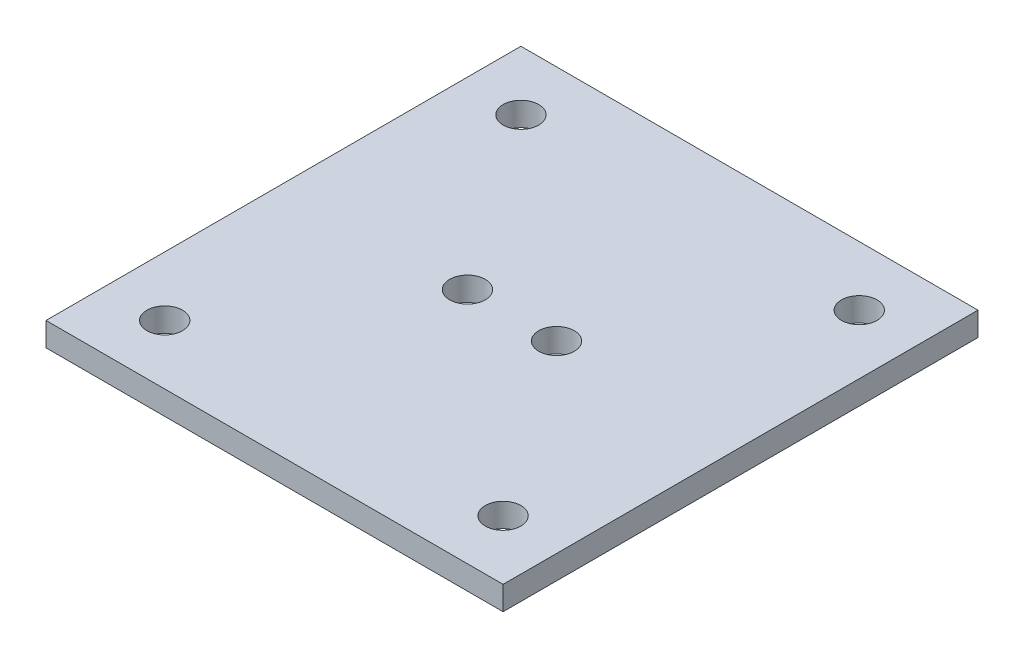
ISO-10303-21;
HEADER;
FILE_DESCRIPTION(('STEP AP214'),'2;1');
FILE_NAME('part.step','',(''),(''),'','','');
FILE_SCHEMA(('AUTOMOTIVE_DESIGN { 1 0 10303 214 1 1 1 1 }'));
ENDSEC;
DATA;
#1=APPLICATION_CONTEXT('core data for automotive mechanical design processes');
#2=APPLICATION_PROTOCOL_DEFINITION('international standard','automotive_design',2000,#1);
#3=PRODUCT_CONTEXT('',#1,'mechanical');
#4=PRODUCT('Part','Part','',(#3));
#5=PRODUCT_RELATED_PRODUCT_CATEGORY('part','',(#4));
#6=PRODUCT_DEFINITION_FORMATION('','',#4);
#7=PRODUCT_DEFINITION_CONTEXT('part definition',#1,'design');
#8=PRODUCT_DEFINITION('design','',#6,#7);
#9=PRODUCT_DEFINITION_SHAPE('','',#8);
#10=(LENGTH_UNIT() NAMED_UNIT(*) SI_UNIT(.MILLI.,.METRE.));
#11=(NAMED_UNIT(*) PLANE_ANGLE_UNIT() SI_UNIT($,.RADIAN.));
#12=(NAMED_UNIT(*) SI_UNIT($,.STERADIAN.) SOLID_ANGLE_UNIT());
#13=UNCERTAINTY_MEASURE_WITH_UNIT(LENGTH_MEASURE(1.E-05),#10,'distance_accuracy_value','');
#14=(GEOMETRIC_REPRESENTATION_CONTEXT(3) GLOBAL_UNCERTAINTY_ASSIGNED_CONTEXT((#13)) GLOBAL_UNIT_ASSIGNED_CONTEXT((#10,
#11,#12)) REPRESENTATION_CONTEXT('',''));
#15=CARTESIAN_POINT('',(0.,0.,0.));
#16=DIRECTION('',(0.,0.,1.));
#17=DIRECTION('',(1.,0.,0.));
#18=AXIS2_PLACEMENT_3D('',#15,#16,#17);
#19=CARTESIAN_POINT('',(0.,2.,0.));
#20=DIRECTION('',(0.,1.,0.));
#21=DIRECTION('',(0.,0.,1.));
#22=AXIS2_PLACEMENT_3D('',#19,#20,#21);
#23=PLANE('',#22);
#24=CARTESIAN_POINT('',(28.5,2.,30.));
#25=DIRECTION('',(0.,1.,0.));
#26=DIRECTION('',(0.,0.,-1.));
#27=AXIS2_PLACEMENT_3D('',#24,#25,#26);
#28=CIRCLE('',#27,3.);
#29=CARTESIAN_POINT('',(28.5,2.,27.));
#30=VERTEX_POINT('',#29);
#31=EDGE_CURVE('E133',#30,#30,#28,.T.);
#32=ORIENTED_EDGE('',*,*,#31,.F.);
#33=EDGE_LOOP('',(#32));
#34=FACE_BOUND('',#33,.T.);
#35=CARTESIAN_POINT('',(-28.5,2.,-30.));
#36=DIRECTION('',(0.,1.,0.));
#37=DIRECTION('',(0.,0.,1.));
#38=AXIS2_PLACEMENT_3D('',#35,#36,#37);
#39=CIRCLE('',#38,3.);
#40=CARTESIAN_POINT('',(-28.5,2.,-27.));
#41=VERTEX_POINT('',#40);
#42=EDGE_CURVE('E121',#41,#41,#39,.T.);
#43=ORIENTED_EDGE('',*,*,#42,.F.);
#44=EDGE_LOOP('',(#43));
#45=FACE_BOUND('',#44,.T.);
#46=CARTESIAN_POINT('',(-7.5,2.,0.));
#47=DIRECTION('',(0.,1.,0.));
#48=DIRECTION('',(0.,0.,1.));
#49=AXIS2_PLACEMENT_3D('',#46,#47,#48);
#50=CIRCLE('',#49,3.);
#51=CARTESIAN_POINT('',(-7.5,2.,3.));
#52=VERTEX_POINT('',#51);
#53=EDGE_CURVE('E100',#52,#52,#50,.T.);
#54=ORIENTED_EDGE('',*,*,#53,.F.);
#55=EDGE_LOOP('',(#54));
#56=FACE_BOUND('',#55,.T.);
#57=DIRECTION('',(0.,0.,1.));
#58=VECTOR('',#57,1.);
#59=CARTESIAN_POINT('',(-38.5,2.,40.));
#60=LINE('',#59,#58);
#61=CARTESIAN_POINT('',(-38.5,2.,-40.));
#62=VERTEX_POINT('',#61);
#63=CARTESIAN_POINT('',(-38.5,2.,40.));
#64=VERTEX_POINT('',#63);
#65=EDGE_CURVE('E85',#62,#64,#60,.T.);
#66=ORIENTED_EDGE('',*,*,#65,.T.);
#67=DIRECTION('',(1.,0.,0.));
#68=VECTOR('',#67,1.);
#69=CARTESIAN_POINT('',(38.5,2.,40.));
#70=LINE('',#69,#68);
#71=CARTESIAN_POINT('',(38.5,2.,40.));
#72=VERTEX_POINT('',#71);
#73=EDGE_CURVE('E80',#64,#72,#70,.T.);
#74=ORIENTED_EDGE('',*,*,#73,.T.);
#75=DIRECTION('',(0.,0.,-1.));
#76=VECTOR('',#75,1.);
#77=CARTESIAN_POINT('',(38.5,2.,40.));
#78=LINE('',#77,#76);
#79=CARTESIAN_POINT('',(38.5,2.,-40.));
#80=VERTEX_POINT('',#79);
#81=EDGE_CURVE('E83',#72,#80,#78,.T.);
#82=ORIENTED_EDGE('',*,*,#81,.T.);
#83=DIRECTION('',(-1.,0.,0.));
#84=VECTOR('',#83,1.);
#85=CARTESIAN_POINT('',(38.5,2.,-40.));
#86=LINE('',#85,#84);
#87=EDGE_CURVE('E50',#80,#62,#86,.T.);
#88=ORIENTED_EDGE('',*,*,#87,.T.);
#89=EDGE_LOOP('',(#66,#74,#82,#88));
#90=FACE_BOUND('',#89,.T.);
#91=CARTESIAN_POINT('',(7.5,2.,0.));
#92=DIRECTION('',(0.,1.,0.));
#93=DIRECTION('',(0.,0.,1.));
#94=AXIS2_PLACEMENT_3D('',#91,#92,#93);
#95=CIRCLE('',#94,3.);
#96=CARTESIAN_POINT('',(7.5,2.,3.));
#97=VERTEX_POINT('',#96);
#98=EDGE_CURVE('E115',#97,#97,#95,.T.);
#99=ORIENTED_EDGE('',*,*,#98,.F.);
#100=EDGE_LOOP('',(#99));
#101=FACE_BOUND('',#100,.T.);
#102=CARTESIAN_POINT('',(28.5,2.,-30.));
#103=DIRECTION('',(0.,1.,0.));
#104=DIRECTION('',(0.,0.,1.));
#105=AXIS2_PLACEMENT_3D('',#102,#103,#104);
#106=CIRCLE('',#105,3.);
#107=CARTESIAN_POINT('',(28.5,2.,-27.));
#108=VERTEX_POINT('',#107);
#109=EDGE_CURVE('E127',#108,#108,#106,.T.);
#110=ORIENTED_EDGE('',*,*,#109,.F.);
#111=EDGE_LOOP('',(#110));
#112=FACE_BOUND('',#111,.T.);
#113=CARTESIAN_POINT('',(-28.5,2.,30.));
#114=DIRECTION('',(0.,1.,0.));
#115=DIRECTION('',(0.,0.,-1.));
#116=AXIS2_PLACEMENT_3D('',#113,#114,#115);
#117=CIRCLE('',#116,3.);
#118=CARTESIAN_POINT('',(-28.5,2.,27.));
#119=VERTEX_POINT('',#118);
#120=EDGE_CURVE('E139',#119,#119,#117,.T.);
#121=ORIENTED_EDGE('',*,*,#120,.F.);
#122=EDGE_LOOP('',(#121));
#123=FACE_BOUND('',#122,.T.);
#124=ADVANCED_FACE('F33',(#34,#45,#56,#90,#101,#112,#123),#23,.T.);
#125=CARTESIAN_POINT('',(0.,-2.,0.));
#126=DIRECTION('',(0.,1.,0.));
#127=DIRECTION('',(0.,0.,1.));
#128=AXIS2_PLACEMENT_3D('',#125,#126,#127);
#129=PLANE('',#128);
#130=DIRECTION('',(0.,0.,1.));
#131=VECTOR('',#130,1.);
#132=CARTESIAN_POINT('',(-38.5,-2.,40.));
#133=LINE('',#132,#131);
#134=CARTESIAN_POINT('',(-38.5,-2.,-40.));
#135=VERTEX_POINT('',#134);
#136=CARTESIAN_POINT('',(-38.5,-2.,40.));
#137=VERTEX_POINT('',#136);
#138=EDGE_CURVE('E97',#135,#137,#133,.T.);
#139=ORIENTED_EDGE('',*,*,#138,.F.);
#140=DIRECTION('',(-1.,0.,0.));
#141=VECTOR('',#140,1.);
#142=CARTESIAN_POINT('',(38.5,-2.,-40.));
#143=LINE('',#142,#141);
#144=CARTESIAN_POINT('',(38.5,-2.,-40.));
#145=VERTEX_POINT('',#144);
#146=EDGE_CURVE('E73',#145,#135,#143,.T.);
#147=ORIENTED_EDGE('',*,*,#146,.F.);
#148=DIRECTION('',(0.,0.,-1.));
#149=VECTOR('',#148,1.);
#150=CARTESIAN_POINT('',(38.5,-2.,40.));
#151=LINE('',#150,#149);
#152=CARTESIAN_POINT('',(38.5,-2.,40.));
#153=VERTEX_POINT('',#152);
#154=EDGE_CURVE('E67',#153,#145,#151,.T.);
#155=ORIENTED_EDGE('',*,*,#154,.F.);
#156=DIRECTION('',(1.,0.,0.));
#157=VECTOR('',#156,1.);
#158=CARTESIAN_POINT('',(38.5,-2.,40.));
#159=LINE('',#158,#157);
#160=EDGE_CURVE('E89',#137,#153,#159,.T.);
#161=ORIENTED_EDGE('',*,*,#160,.F.);
#162=EDGE_LOOP('',(#139,#147,#155,#161));
#163=FACE_BOUND('',#162,.T.);
#164=CARTESIAN_POINT('',(-7.5,-2.,0.));
#165=DIRECTION('',(0.,1.,0.));
#166=DIRECTION('',(0.,0.,1.));
#167=AXIS2_PLACEMENT_3D('',#164,#165,#166);
#168=CIRCLE('',#167,3.);
#169=CARTESIAN_POINT('',(-7.5,-2.,3.));
#170=VERTEX_POINT('',#169);
#171=EDGE_CURVE('E112',#170,#170,#168,.T.);
#172=ORIENTED_EDGE('',*,*,#171,.T.);
#173=EDGE_LOOP('',(#172));
#174=FACE_BOUND('',#173,.T.);
#175=CARTESIAN_POINT('',(7.5,-2.,0.));
#176=DIRECTION('',(0.,1.,0.));
#177=DIRECTION('',(0.,0.,1.));
#178=AXIS2_PLACEMENT_3D('',#175,#176,#177);
#179=CIRCLE('',#178,3.);
#180=CARTESIAN_POINT('',(7.5,-2.,3.));
#181=VERTEX_POINT('',#180);
#182=EDGE_CURVE('E118',#181,#181,#179,.T.);
#183=ORIENTED_EDGE('',*,*,#182,.T.);
#184=EDGE_LOOP('',(#183));
#185=FACE_BOUND('',#184,.T.);
#186=CARTESIAN_POINT('',(-28.5,-2.,-30.));
#187=DIRECTION('',(0.,1.,0.));
#188=DIRECTION('',(0.,0.,1.));
#189=AXIS2_PLACEMENT_3D('',#186,#187,#188);
#190=CIRCLE('',#189,3.);
#191=CARTESIAN_POINT('',(-28.5,-2.,-27.));
#192=VERTEX_POINT('',#191);
#193=EDGE_CURVE('E124',#192,#192,#190,.T.);
#194=ORIENTED_EDGE('',*,*,#193,.T.);
#195=EDGE_LOOP('',(#194));
#196=FACE_BOUND('',#195,.T.);
#197=CARTESIAN_POINT('',(28.5,-2.,-30.));
#198=DIRECTION('',(0.,1.,0.));
#199=DIRECTION('',(0.,0.,1.));
#200=AXIS2_PLACEMENT_3D('',#197,#198,#199);
#201=CIRCLE('',#200,3.);
#202=CARTESIAN_POINT('',(28.5,-2.,-27.));
#203=VERTEX_POINT('',#202);
#204=EDGE_CURVE('E130',#203,#203,#201,.T.);
#205=ORIENTED_EDGE('',*,*,#204,.T.);
#206=EDGE_LOOP('',(#205));
#207=FACE_BOUND('',#206,.T.);
#208=CARTESIAN_POINT('',(28.5,-2.,30.));
#209=DIRECTION('',(0.,1.,0.));
#210=DIRECTION('',(0.,0.,-1.));
#211=AXIS2_PLACEMENT_3D('',#208,#209,#210);
#212=CIRCLE('',#211,3.);
#213=CARTESIAN_POINT('',(28.5,-2.,27.));
#214=VERTEX_POINT('',#213);
#215=EDGE_CURVE('E136',#214,#214,#212,.T.);
#216=ORIENTED_EDGE('',*,*,#215,.T.);
#217=EDGE_LOOP('',(#216));
#218=FACE_BOUND('',#217,.T.);
#219=CARTESIAN_POINT('',(-28.5,-2.,30.));
#220=DIRECTION('',(0.,1.,0.));
#221=DIRECTION('',(0.,0.,-1.));
#222=AXIS2_PLACEMENT_3D('',#219,#220,#221);
#223=CIRCLE('',#222,3.);
#224=CARTESIAN_POINT('',(-28.5,-2.,27.));
#225=VERTEX_POINT('',#224);
#226=EDGE_CURVE('E142',#225,#225,#223,.T.);
#227=ORIENTED_EDGE('',*,*,#226,.T.);
#228=EDGE_LOOP('',(#227));
#229=FACE_BOUND('',#228,.T.);
#230=ADVANCED_FACE('F108',(#163,#174,#185,#196,#207,#218,#229),#129,.F.);
#231=CARTESIAN_POINT('',(-38.5,2.,40.));
#232=DIRECTION('',(1.,0.,0.));
#233=DIRECTION('',(0.,0.,-1.));
#234=AXIS2_PLACEMENT_3D('',#231,#232,#233);
#235=PLANE('',#234);
#236=ORIENTED_EDGE('',*,*,#138,.T.);
#237=DIRECTION('',(0.,-1.,0.));
#238=VECTOR('',#237,1.);
#239=CARTESIAN_POINT('',(-38.5,2.,40.));
#240=LINE('',#239,#238);
#241=EDGE_CURVE('E11',#64,#137,#240,.T.);
#242=ORIENTED_EDGE('',*,*,#241,.F.);
#243=ORIENTED_EDGE('',*,*,#65,.F.);
#244=DIRECTION('',(0.,-1.,0.));
#245=VECTOR('',#244,1.);
#246=CARTESIAN_POINT('',(-38.5,2.,-40.));
#247=LINE('',#246,#245);
#248=EDGE_CURVE('E93',#62,#135,#247,.T.);
#249=ORIENTED_EDGE('',*,*,#248,.T.);
#250=EDGE_LOOP('',(#236,#242,#243,#249));
#251=FACE_BOUND('',#250,.T.);
#252=ADVANCED_FACE('F35',(#251),#235,.F.);
#253=CARTESIAN_POINT('',(38.5,2.,40.));
#254=DIRECTION('',(0.,0.,-1.));
#255=DIRECTION('',(-1.,0.,0.));
#256=AXIS2_PLACEMENT_3D('',#253,#254,#255);
#257=PLANE('',#256);
#258=ORIENTED_EDGE('',*,*,#160,.T.);
#259=DIRECTION('',(0.,-1.,0.));
#260=VECTOR('',#259,1.);
#261=CARTESIAN_POINT('',(38.5,2.,40.));
#262=LINE('',#261,#260);
#263=EDGE_CURVE('E42',#72,#153,#262,.T.);
#264=ORIENTED_EDGE('',*,*,#263,.F.);
#265=ORIENTED_EDGE('',*,*,#73,.F.);
#266=ORIENTED_EDGE('',*,*,#241,.T.);
#267=EDGE_LOOP('',(#258,#264,#265,#266));
#268=FACE_BOUND('',#267,.T.);
#269=ADVANCED_FACE('F88',(#268),#257,.F.);
#270=CARTESIAN_POINT('',(38.5,2.,40.));
#271=DIRECTION('',(-1.,0.,0.));
#272=DIRECTION('',(0.,0.,1.));
#273=AXIS2_PLACEMENT_3D('',#270,#271,#272);
#274=PLANE('',#273);
#275=ORIENTED_EDGE('',*,*,#154,.T.);
#276=DIRECTION('',(0.,-1.,0.));
#277=VECTOR('',#276,1.);
#278=CARTESIAN_POINT('',(38.5,2.,-40.));
#279=LINE('',#278,#277);
#280=EDGE_CURVE('E90',#80,#145,#279,.T.);
#281=ORIENTED_EDGE('',*,*,#280,.F.);
#282=ORIENTED_EDGE('',*,*,#81,.F.);
#283=ORIENTED_EDGE('',*,*,#263,.T.);
#284=EDGE_LOOP('',(#275,#281,#282,#283));
#285=FACE_BOUND('',#284,.T.);
#286=ADVANCED_FACE('F91',(#285),#274,.F.);
#287=CARTESIAN_POINT('',(38.5,2.,-40.));
#288=DIRECTION('',(0.,0.,1.));
#289=DIRECTION('',(1.,0.,0.));
#290=AXIS2_PLACEMENT_3D('',#287,#288,#289);
#291=PLANE('',#290);
#292=ORIENTED_EDGE('',*,*,#146,.T.);
#293=ORIENTED_EDGE('',*,*,#248,.F.);
#294=ORIENTED_EDGE('',*,*,#87,.F.);
#295=ORIENTED_EDGE('',*,*,#280,.T.);
#296=EDGE_LOOP('',(#292,#293,#294,#295));
#297=FACE_BOUND('',#296,.T.);
#298=ADVANCED_FACE('F105',(#297),#291,.F.);
#299=CARTESIAN_POINT('',(-7.5,2.,0.));
#300=DIRECTION('',(0.,-1.,0.));
#301=DIRECTION('',(0.,0.,-1.));
#302=AXIS2_PLACEMENT_3D('',#299,#300,#301);
#303=CYLINDRICAL_SURFACE('',#302,3.);
#304=ORIENTED_EDGE('',*,*,#53,.T.);
#305=EDGE_LOOP('',(#304));
#306=FACE_BOUND('',#305,.T.);
#307=ORIENTED_EDGE('',*,*,#171,.F.);
#308=EDGE_LOOP('',(#307));
#309=FACE_BOUND('',#308,.T.);
#310=ADVANCED_FACE('F161',(#306,#309),#303,.F.);
#311=CARTESIAN_POINT('',(7.5,2.,0.));
#312=DIRECTION('',(0.,-1.,0.));
#313=DIRECTION('',(0.,0.,-1.));
#314=AXIS2_PLACEMENT_3D('',#311,#312,#313);
#315=CYLINDRICAL_SURFACE('',#314,3.);
#316=ORIENTED_EDGE('',*,*,#98,.T.);
#317=EDGE_LOOP('',(#316));
#318=FACE_BOUND('',#317,.T.);
#319=ORIENTED_EDGE('',*,*,#182,.F.);
#320=EDGE_LOOP('',(#319));
#321=FACE_BOUND('',#320,.T.);
#322=ADVANCED_FACE('F207',(#318,#321),#315,.F.);
#323=CARTESIAN_POINT('',(-28.5,2.,-30.));
#324=DIRECTION('',(0.,-1.,0.));
#325=DIRECTION('',(0.,0.,-1.));
#326=AXIS2_PLACEMENT_3D('',#323,#324,#325);
#327=CYLINDRICAL_SURFACE('',#326,3.);
#328=ORIENTED_EDGE('',*,*,#42,.T.);
#329=EDGE_LOOP('',(#328));
#330=FACE_BOUND('',#329,.T.);
#331=ORIENTED_EDGE('',*,*,#193,.F.);
#332=EDGE_LOOP('',(#331));
#333=FACE_BOUND('',#332,.T.);
#334=ADVANCED_FACE('F215',(#330,#333),#327,.F.);
#335=CARTESIAN_POINT('',(28.5,2.,-30.));
#336=DIRECTION('',(0.,-1.,0.));
#337=DIRECTION('',(0.,0.,-1.));
#338=AXIS2_PLACEMENT_3D('',#335,#336,#337);
#339=CYLINDRICAL_SURFACE('',#338,3.);
#340=ORIENTED_EDGE('',*,*,#109,.T.);
#341=EDGE_LOOP('',(#340));
#342=FACE_BOUND('',#341,.T.);
#343=ORIENTED_EDGE('',*,*,#204,.F.);
#344=EDGE_LOOP('',(#343));
#345=FACE_BOUND('',#344,.T.);
#346=ADVANCED_FACE('F223',(#342,#345),#339,.F.);
#347=CARTESIAN_POINT('',(28.5,2.,30.));
#348=DIRECTION('',(0.,-1.,0.));
#349=DIRECTION('',(0.,0.,-1.));
#350=AXIS2_PLACEMENT_3D('',#347,#348,#349);
#351=CYLINDRICAL_SURFACE('',#350,3.);
#352=ORIENTED_EDGE('',*,*,#31,.T.);
#353=EDGE_LOOP('',(#352));
#354=FACE_BOUND('',#353,.T.);
#355=ORIENTED_EDGE('',*,*,#215,.F.);
#356=EDGE_LOOP('',(#355));
#357=FACE_BOUND('',#356,.T.);
#358=ADVANCED_FACE('F232',(#354,#357),#351,.F.);
#359=CARTESIAN_POINT('',(-28.5,2.,30.));
#360=DIRECTION('',(0.,-1.,0.));
#361=DIRECTION('',(0.,0.,-1.));
#362=AXIS2_PLACEMENT_3D('',#359,#360,#361);
#363=CYLINDRICAL_SURFACE('',#362,3.);
#364=ORIENTED_EDGE('',*,*,#120,.T.);
#365=EDGE_LOOP('',(#364));
#366=FACE_BOUND('',#365,.T.);
#367=ORIENTED_EDGE('',*,*,#226,.F.);
#368=EDGE_LOOP('',(#367));
#369=FACE_BOUND('',#368,.T.);
#370=ADVANCED_FACE('F148',(#366,#369),#363,.F.);
#371=CLOSED_SHELL('',(#124,#230,#252,#269,#286,#298,#310,#322,#334,#346,#358,#370));
#372=MANIFOLD_SOLID_BREP('B2',#371);
#373=ADVANCED_BREP_SHAPE_REPRESENTATION('',(#18,#372),#14);
#374=SHAPE_DEFINITION_REPRESENTATION(#9,#373);
ENDSEC;
END-ISO-10303-21;
